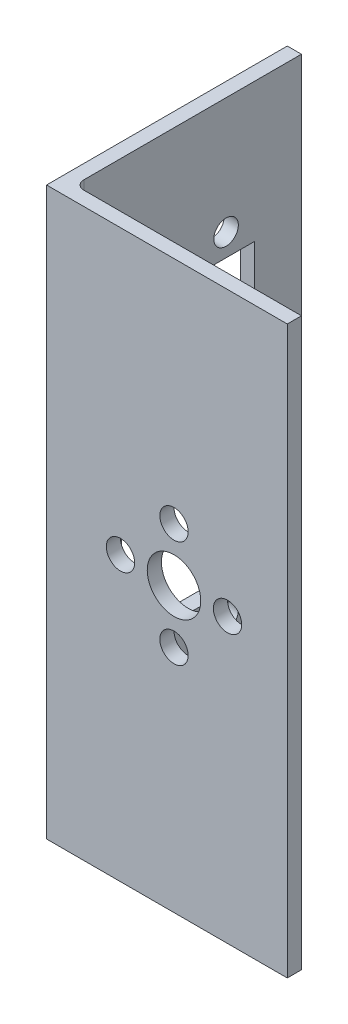
ISO-10303-21;
HEADER;
FILE_DESCRIPTION(('STEP AP214'),'2;1');
FILE_NAME('part.step','',(''),(''),'','','');
FILE_SCHEMA(('AUTOMOTIVE_DESIGN { 1 0 10303 214 1 1 1 1 }'));
ENDSEC;
DATA;
#1=APPLICATION_CONTEXT('core data for automotive mechanical design processes');
#2=APPLICATION_PROTOCOL_DEFINITION('international standard','automotive_design',2000,#1);
#3=PRODUCT_CONTEXT('',#1,'mechanical');
#4=PRODUCT('Part','Part','',(#3));
#5=PRODUCT_RELATED_PRODUCT_CATEGORY('part','',(#4));
#6=PRODUCT_DEFINITION_FORMATION('','',#4);
#7=PRODUCT_DEFINITION_CONTEXT('part definition',#1,'design');
#8=PRODUCT_DEFINITION('design','',#6,#7);
#9=PRODUCT_DEFINITION_SHAPE('','',#8);
#10=(LENGTH_UNIT() NAMED_UNIT(*) SI_UNIT(.MILLI.,.METRE.));
#11=(NAMED_UNIT(*) PLANE_ANGLE_UNIT() SI_UNIT($,.RADIAN.));
#12=(NAMED_UNIT(*) SI_UNIT($,.STERADIAN.) SOLID_ANGLE_UNIT());
#13=UNCERTAINTY_MEASURE_WITH_UNIT(LENGTH_MEASURE(1.E-05),#10,'distance_accuracy_value','');
#14=(GEOMETRIC_REPRESENTATION_CONTEXT(3) GLOBAL_UNCERTAINTY_ASSIGNED_CONTEXT((#13)) GLOBAL_UNIT_ASSIGNED_CONTEXT((#10,
#11,#12)) REPRESENTATION_CONTEXT('',''));
#15=CARTESIAN_POINT('',(0.,0.,0.));
#16=DIRECTION('',(0.,0.,1.));
#17=DIRECTION('',(1.,0.,0.));
#18=AXIS2_PLACEMENT_3D('',#15,#16,#17);
#19=CARTESIAN_POINT('',(-3.17500000000001,127.,-50.8));
#20=DIRECTION('',(0.,0.,1.));
#21=DIRECTION('',(1.,0.,0.));
#22=AXIS2_PLACEMENT_3D('',#19,#20,#21);
#23=PLANE('',#22);
#24=DIRECTION('',(-1.,0.,0.));
#25=VECTOR('',#24,1.);
#26=CARTESIAN_POINT('',(-3.17500000000001,0.,-50.8));
#27=LINE('',#26,#25);
#28=CARTESIAN_POINT('',(0.,0.,-50.8));
#29=VERTEX_POINT('',#28);
#30=CARTESIAN_POINT('',(-3.17500000000001,0.,-50.8));
#31=VERTEX_POINT('',#30);
#32=EDGE_CURVE('E204',#29,#31,#27,.T.);
#33=ORIENTED_EDGE('',*,*,#32,.T.);
#34=DIRECTION('',(0.,-1.,0.));
#35=VECTOR('',#34,1.);
#36=CARTESIAN_POINT('',(-3.17500000000001,127.,-50.8));
#37=LINE('',#36,#35);
#38=CARTESIAN_POINT('',(-3.17500000000001,127.,-50.8));
#39=VERTEX_POINT('',#38);
#40=EDGE_CURVE('E242',#39,#31,#37,.T.);
#41=ORIENTED_EDGE('',*,*,#40,.F.);
#42=DIRECTION('',(-1.,0.,0.));
#43=VECTOR('',#42,1.);
#44=CARTESIAN_POINT('',(-3.17500000000001,127.,-50.8));
#45=LINE('',#44,#43);
#46=CARTESIAN_POINT('',(0.,127.,-50.8));
#47=VERTEX_POINT('',#46);
#48=EDGE_CURVE('E205',#47,#39,#45,.T.);
#49=ORIENTED_EDGE('',*,*,#48,.F.);
#50=DIRECTION('',(0.,-1.,0.));
#51=VECTOR('',#50,1.);
#52=CARTESIAN_POINT('',(0.,127.,-50.8));
#53=LINE('',#52,#51);
#54=EDGE_CURVE('E219',#47,#29,#53,.T.);
#55=ORIENTED_EDGE('',*,*,#54,.T.);
#56=EDGE_LOOP('',(#33,#41,#49,#55));
#57=FACE_BOUND('',#56,.T.);
#58=ADVANCED_FACE('F41',(#57),#23,.F.);
#59=CARTESIAN_POINT('',(-3.17500000000001,127.,-50.8));
#60=DIRECTION('',(1.,0.,0.));
#61=DIRECTION('',(0.,0.,-1.));
#62=AXIS2_PLACEMENT_3D('',#59,#60,#61);
#63=PLANE('',#62);
#64=CARTESIAN_POINT('',(-3.17500000000001,26.0999999999999,-33.9));
#65=DIRECTION('',(1.,0.,0.));
#66=DIRECTION('',(0.,0.,-1.));
#67=AXIS2_PLACEMENT_3D('',#64,#65,#66);
#68=CIRCLE('',#67,2.74999999999999);
#69=CARTESIAN_POINT('',(-3.17500000000001,26.0999999999999,-36.65));
#70=VERTEX_POINT('',#69);
#71=EDGE_CURVE('E155',#70,#70,#68,.F.);
#72=ORIENTED_EDGE('',*,*,#71,.F.);
#73=EDGE_LOOP('',(#72));
#74=FACE_BOUND('',#73,.T.);
#75=CARTESIAN_POINT('',(-3.17500000000001,100.9,-33.9));
#76=DIRECTION('',(1.,0.,0.));
#77=DIRECTION('',(0.,0.,-1.));
#78=AXIS2_PLACEMENT_3D('',#75,#76,#77);
#79=CIRCLE('',#78,2.75);
#80=CARTESIAN_POINT('',(-3.17500000000001,100.9,-36.65));
#81=VERTEX_POINT('',#80);
#82=EDGE_CURVE('E163',#81,#81,#79,.F.);
#83=ORIENTED_EDGE('',*,*,#82,.F.);
#84=EDGE_LOOP('',(#83));
#85=FACE_BOUND('',#84,.T.);
#86=CARTESIAN_POINT('',(-3.17500000000001,100.9,-16.9));
#87=DIRECTION('',(1.,0.,0.));
#88=DIRECTION('',(0.,0.,-1.));
#89=AXIS2_PLACEMENT_3D('',#86,#87,#88);
#90=CIRCLE('',#89,2.74999999999997);
#91=CARTESIAN_POINT('',(-3.17500000000001,100.9,-19.65));
#92=VERTEX_POINT('',#91);
#93=EDGE_CURVE('E151',#92,#92,#90,.F.);
#94=ORIENTED_EDGE('',*,*,#93,.F.);
#95=EDGE_LOOP('',(#94));
#96=FACE_BOUND('',#95,.T.);
#97=DIRECTION('',(0.,0.,-1.));
#98=VECTOR('',#97,1.);
#99=CARTESIAN_POINT('',(-3.17500000000001,95.9,-10.5));
#100=LINE('',#99,#98);
#101=CARTESIAN_POINT('',(-3.17500000000001,95.9,-10.5));
#102=VERTEX_POINT('',#101);
#103=CARTESIAN_POINT('',(-3.17500000000001,95.9,-40.3));
#104=VERTEX_POINT('',#103);
#105=EDGE_CURVE('E128',#102,#104,#100,.T.);
#106=ORIENTED_EDGE('',*,*,#105,.F.);
#107=DIRECTION('',(0.,1.,0.));
#108=VECTOR('',#107,1.);
#109=CARTESIAN_POINT('',(-3.17500000000001,95.9,-10.5));
#110=LINE('',#109,#108);
#111=CARTESIAN_POINT('',(-3.17500000000001,31.1,-10.5));
#112=VERTEX_POINT('',#111);
#113=EDGE_CURVE('E138',#112,#102,#110,.T.);
#114=ORIENTED_EDGE('',*,*,#113,.F.);
#115=DIRECTION('',(0.,0.,1.));
#116=VECTOR('',#115,1.);
#117=CARTESIAN_POINT('',(-3.17500000000001,31.1,-10.5));
#118=LINE('',#117,#116);
#119=CARTESIAN_POINT('',(-3.17500000000001,31.1,-40.3));
#120=VERTEX_POINT('',#119);
#121=EDGE_CURVE('E135',#120,#112,#118,.T.);
#122=ORIENTED_EDGE('',*,*,#121,.F.);
#123=DIRECTION('',(0.,-1.,0.));
#124=VECTOR('',#123,1.);
#125=CARTESIAN_POINT('',(-3.17500000000001,95.9,-40.3));
#126=LINE('',#125,#124);
#127=EDGE_CURVE('E149',#104,#120,#126,.T.);
#128=ORIENTED_EDGE('',*,*,#127,.F.);
#129=EDGE_LOOP('',(#106,#114,#122,#128));
#130=FACE_BOUND('',#129,.T.);
#131=CARTESIAN_POINT('',(-3.17500000000001,26.0999999999999,-16.9));
#132=DIRECTION('',(1.,0.,0.));
#133=DIRECTION('',(0.,0.,-1.));
#134=AXIS2_PLACEMENT_3D('',#131,#132,#133);
#135=CIRCLE('',#134,2.74999999999997);
#136=CARTESIAN_POINT('',(-3.17500000000001,26.0999999999999,-19.65));
#137=VERTEX_POINT('',#136);
#138=EDGE_CURVE('E171',#137,#137,#135,.F.);
#139=ORIENTED_EDGE('',*,*,#138,.F.);
#140=EDGE_LOOP('',(#139));
#141=FACE_BOUND('',#140,.T.);
#142=DIRECTION('',(0.,0.,1.));
#143=VECTOR('',#142,1.);
#144=CARTESIAN_POINT('',(-3.17500000000001,0.,-50.8));
#145=LINE('',#144,#143);
#146=CARTESIAN_POINT('',(-3.17500000000001,0.,3.175));
#147=VERTEX_POINT('',#146);
#148=EDGE_CURVE('E222',#31,#147,#145,.T.);
#149=ORIENTED_EDGE('',*,*,#148,.T.);
#150=DIRECTION('',(0.,-1.,0.));
#151=VECTOR('',#150,1.);
#152=CARTESIAN_POINT('',(-3.17500000000001,127.,3.175));
#153=LINE('',#152,#151);
#154=CARTESIAN_POINT('',(-3.17500000000001,127.,3.175));
#155=VERTEX_POINT('',#154);
#156=EDGE_CURVE('E239',#155,#147,#153,.T.);
#157=ORIENTED_EDGE('',*,*,#156,.F.);
#158=DIRECTION('',(0.,0.,1.));
#159=VECTOR('',#158,1.);
#160=CARTESIAN_POINT('',(-3.17500000000001,127.,-50.8));
#161=LINE('',#160,#159);
#162=EDGE_CURVE('E208',#39,#155,#161,.T.);
#163=ORIENTED_EDGE('',*,*,#162,.F.);
#164=ORIENTED_EDGE('',*,*,#40,.T.);
#165=EDGE_LOOP('',(#149,#157,#163,#164));
#166=FACE_BOUND('',#165,.T.);
#167=ADVANCED_FACE('F147',(#74,#85,#96,#130,#141,#166),#63,.F.);
#168=CARTESIAN_POINT('',(-3.17500000000001,127.,3.175));
#169=DIRECTION('',(0.,0.,-1.));
#170=DIRECTION('',(-1.,0.,0.));
#171=AXIS2_PLACEMENT_3D('',#168,#169,#170);
#172=PLANE('',#171);
#173=CARTESIAN_POINT('',(13.4,63.5000000000002,3.175));
#174=DIRECTION('',(0.,0.,-1.));
#175=DIRECTION('',(-1.,0.,0.));
#176=AXIS2_PLACEMENT_3D('',#173,#174,#175);
#177=CIRCLE('',#176,3.175);
#178=CARTESIAN_POINT('',(10.225,63.5000000000002,3.175));
#179=VERTEX_POINT('',#178);
#180=EDGE_CURVE('E187',#179,#179,#177,.F.);
#181=ORIENTED_EDGE('',*,*,#180,.F.);
#182=EDGE_LOOP('',(#181));
#183=FACE_BOUND('',#182,.T.);
#184=CARTESIAN_POINT('',(25.3999999999997,51.5000000000002,3.175));
#185=DIRECTION('',(0.,0.,-1.));
#186=DIRECTION('',(-1.,0.,0.));
#187=AXIS2_PLACEMENT_3D('',#184,#185,#186);
#188=CIRCLE('',#187,3.175);
#189=CARTESIAN_POINT('',(22.2249999999997,51.5000000000002,3.175));
#190=VERTEX_POINT('',#189);
#191=EDGE_CURVE('E182',#190,#190,#188,.F.);
#192=ORIENTED_EDGE('',*,*,#191,.F.);
#193=EDGE_LOOP('',(#192));
#194=FACE_BOUND('',#193,.T.);
#195=CARTESIAN_POINT('',(37.3999999999998,63.5,3.175));
#196=DIRECTION('',(0.,0.,-1.));
#197=DIRECTION('',(-1.,0.,0.));
#198=AXIS2_PLACEMENT_3D('',#195,#196,#197);
#199=CIRCLE('',#198,3.175);
#200=CARTESIAN_POINT('',(34.2249999999998,63.5,3.175));
#201=VERTEX_POINT('',#200);
#202=EDGE_CURVE('E175',#201,#201,#199,.F.);
#203=ORIENTED_EDGE('',*,*,#202,.F.);
#204=EDGE_LOOP('',(#203));
#205=FACE_BOUND('',#204,.T.);
#206=CARTESIAN_POINT('',(25.4,75.5,3.175));
#207=DIRECTION('',(0.,0.,-1.));
#208=DIRECTION('',(-1.,0.,0.));
#209=AXIS2_PLACEMENT_3D('',#206,#207,#208);
#210=CIRCLE('',#209,3.175);
#211=CARTESIAN_POINT('',(22.225,75.5,3.175));
#212=VERTEX_POINT('',#211);
#213=EDGE_CURVE('E174',#212,#212,#210,.F.);
#214=ORIENTED_EDGE('',*,*,#213,.F.);
#215=EDGE_LOOP('',(#214));
#216=FACE_BOUND('',#215,.T.);
#217=CARTESIAN_POINT('',(25.4,63.5,3.175));
#218=DIRECTION('',(0.,0.,-1.));
#219=DIRECTION('',(-1.,0.,0.));
#220=AXIS2_PLACEMENT_3D('',#217,#218,#219);
#221=CIRCLE('',#220,6.);
#222=CARTESIAN_POINT('',(19.4,63.5,3.175));
#223=VERTEX_POINT('',#222);
#224=EDGE_CURVE('E201',#223,#223,#221,.F.);
#225=ORIENTED_EDGE('',*,*,#224,.F.);
#226=EDGE_LOOP('',(#225));
#227=FACE_BOUND('',#226,.T.);
#228=DIRECTION('',(1.,0.,0.));
#229=VECTOR('',#228,1.);
#230=CARTESIAN_POINT('',(-3.17500000000001,0.,3.175));
#231=LINE('',#230,#229);
#232=CARTESIAN_POINT('',(50.8,0.,3.175));
#233=VERTEX_POINT('',#232);
#234=EDGE_CURVE('E224',#147,#233,#231,.T.);
#235=ORIENTED_EDGE('',*,*,#234,.T.);
#236=DIRECTION('',(0.,-1.,0.));
#237=VECTOR('',#236,1.);
#238=CARTESIAN_POINT('',(50.8,127.,3.175));
#239=LINE('',#238,#237);
#240=CARTESIAN_POINT('',(50.8,127.,3.175));
#241=VERTEX_POINT('',#240);
#242=EDGE_CURVE('E236',#241,#233,#239,.T.);
#243=ORIENTED_EDGE('',*,*,#242,.F.);
#244=DIRECTION('',(1.,0.,0.));
#245=VECTOR('',#244,1.);
#246=CARTESIAN_POINT('',(-3.17500000000001,127.,3.175));
#247=LINE('',#246,#245);
#248=EDGE_CURVE('E211',#155,#241,#247,.T.);
#249=ORIENTED_EDGE('',*,*,#248,.F.);
#250=ORIENTED_EDGE('',*,*,#156,.T.);
#251=EDGE_LOOP('',(#235,#243,#249,#250));
#252=FACE_BOUND('',#251,.T.);
#253=ADVANCED_FACE('F276',(#183,#194,#205,#216,#227,#252),#172,.F.);
#254=CARTESIAN_POINT('',(50.8,127.,0.));
#255=DIRECTION('',(-1.,0.,0.));
#256=DIRECTION('',(0.,0.,1.));
#257=AXIS2_PLACEMENT_3D('',#254,#255,#256);
#258=PLANE('',#257);
#259=DIRECTION('',(0.,0.,-1.));
#260=VECTOR('',#259,1.);
#261=CARTESIAN_POINT('',(50.8,0.,0.));
#262=LINE('',#261,#260);
#263=CARTESIAN_POINT('',(50.8,0.,0.));
#264=VERTEX_POINT('',#263);
#265=EDGE_CURVE('E226',#233,#264,#262,.T.);
#266=ORIENTED_EDGE('',*,*,#265,.T.);
#267=DIRECTION('',(0.,-1.,0.));
#268=VECTOR('',#267,1.);
#269=CARTESIAN_POINT('',(50.8,127.,0.));
#270=LINE('',#269,#268);
#271=CARTESIAN_POINT('',(50.8,127.,0.));
#272=VERTEX_POINT('',#271);
#273=EDGE_CURVE('E233',#272,#264,#270,.T.);
#274=ORIENTED_EDGE('',*,*,#273,.F.);
#275=DIRECTION('',(0.,0.,-1.));
#276=VECTOR('',#275,1.);
#277=CARTESIAN_POINT('',(50.8,127.,0.));
#278=LINE('',#277,#276);
#279=EDGE_CURVE('E213',#241,#272,#278,.T.);
#280=ORIENTED_EDGE('',*,*,#279,.F.);
#281=ORIENTED_EDGE('',*,*,#242,.T.);
#282=EDGE_LOOP('',(#266,#274,#280,#281));
#283=FACE_BOUND('',#282,.T.);
#284=ADVANCED_FACE('F282',(#283),#258,.F.);
#285=CARTESIAN_POINT('',(0.,127.,0.));
#286=DIRECTION('',(0.,0.,1.));
#287=DIRECTION('',(1.,0.,0.));
#288=AXIS2_PLACEMENT_3D('',#285,#286,#287);
#289=PLANE('',#288);
#290=CARTESIAN_POINT('',(13.4,63.5000000000002,0.));
#291=DIRECTION('',(0.,0.,-1.));
#292=DIRECTION('',(-1.,0.,0.));
#293=AXIS2_PLACEMENT_3D('',#290,#291,#292);
#294=CIRCLE('',#293,3.175);
#295=CARTESIAN_POINT('',(10.225,63.5000000000002,0.));
#296=VERTEX_POINT('',#295);
#297=EDGE_CURVE('E190',#296,#296,#294,.T.);
#298=ORIENTED_EDGE('',*,*,#297,.F.);
#299=EDGE_LOOP('',(#298));
#300=FACE_BOUND('',#299,.T.);
#301=CARTESIAN_POINT('',(25.3999999999997,51.5000000000002,0.));
#302=DIRECTION('',(0.,0.,-1.));
#303=DIRECTION('',(-1.,0.,0.));
#304=AXIS2_PLACEMENT_3D('',#301,#302,#303);
#305=CIRCLE('',#304,3.175);
#306=CARTESIAN_POINT('',(22.2249999999997,51.5000000000002,0.));
#307=VERTEX_POINT('',#306);
#308=EDGE_CURVE('E191',#307,#307,#305,.T.);
#309=ORIENTED_EDGE('',*,*,#308,.F.);
#310=EDGE_LOOP('',(#309));
#311=FACE_BOUND('',#310,.T.);
#312=CARTESIAN_POINT('',(37.3999999999998,63.5,0.));
#313=DIRECTION('',(0.,0.,-1.));
#314=DIRECTION('',(-1.,0.,0.));
#315=AXIS2_PLACEMENT_3D('',#312,#313,#314);
#316=CIRCLE('',#315,3.175);
#317=CARTESIAN_POINT('',(34.2249999999998,63.5,0.));
#318=VERTEX_POINT('',#317);
#319=EDGE_CURVE('E178',#318,#318,#316,.T.);
#320=ORIENTED_EDGE('',*,*,#319,.F.);
#321=EDGE_LOOP('',(#320));
#322=FACE_BOUND('',#321,.T.);
#323=CARTESIAN_POINT('',(25.4,75.5,0.));
#324=DIRECTION('',(0.,0.,-1.));
#325=DIRECTION('',(-1.,0.,0.));
#326=AXIS2_PLACEMENT_3D('',#323,#324,#325);
#327=CIRCLE('',#326,3.175);
#328=CARTESIAN_POINT('',(22.225,75.5,0.));
#329=VERTEX_POINT('',#328);
#330=EDGE_CURVE('E179',#329,#329,#327,.T.);
#331=ORIENTED_EDGE('',*,*,#330,.F.);
#332=EDGE_LOOP('',(#331));
#333=FACE_BOUND('',#332,.T.);
#334=CARTESIAN_POINT('',(25.4,63.5,0.));
#335=DIRECTION('',(0.,0.,-1.));
#336=DIRECTION('',(-1.,0.,0.));
#337=AXIS2_PLACEMENT_3D('',#334,#335,#336);
#338=CIRCLE('',#337,6.);
#339=CARTESIAN_POINT('',(19.4,63.5,0.));
#340=VERTEX_POINT('',#339);
#341=EDGE_CURVE('E194',#340,#340,#338,.T.);
#342=ORIENTED_EDGE('',*,*,#341,.F.);
#343=EDGE_LOOP('',(#342));
#344=FACE_BOUND('',#343,.T.);
#345=DIRECTION('',(-1.,0.,0.));
#346=VECTOR('',#345,1.);
#347=CARTESIAN_POINT('',(0.,0.,0.));
#348=LINE('',#347,#346);
#349=CARTESIAN_POINT('',(2.,0.,0.));
#350=VERTEX_POINT('',#349);
#351=EDGE_CURVE('E228',#264,#350,#348,.T.);
#352=ORIENTED_EDGE('',*,*,#351,.T.);
#353=DIRECTION('',(0.,-1.,0.));
#354=VECTOR('',#353,1.);
#355=CARTESIAN_POINT('',(2.,127.,0.));
#356=LINE('',#355,#354);
#357=CARTESIAN_POINT('',(2.,127.,0.));
#358=VERTEX_POINT('',#357);
#359=EDGE_CURVE('E56',#350,#358,#356,.F.);
#360=ORIENTED_EDGE('',*,*,#359,.T.);
#361=DIRECTION('',(-1.,0.,0.));
#362=VECTOR('',#361,1.);
#363=CARTESIAN_POINT('',(0.,127.,0.));
#364=LINE('',#363,#362);
#365=EDGE_CURVE('E215',#272,#358,#364,.T.);
#366=ORIENTED_EDGE('',*,*,#365,.F.);
#367=ORIENTED_EDGE('',*,*,#273,.T.);
#368=EDGE_LOOP('',(#352,#360,#366,#367));
#369=FACE_BOUND('',#368,.T.);
#370=ADVANCED_FACE('F286',(#300,#311,#322,#333,#344,#369),#289,.F.);
#371=CARTESIAN_POINT('',(0.,127.,-50.8));
#372=DIRECTION('',(-1.,0.,0.));
#373=DIRECTION('',(0.,0.,1.));
#374=AXIS2_PLACEMENT_3D('',#371,#372,#373);
#375=PLANE('',#374);
#376=CARTESIAN_POINT('',(0.,26.0999999999999,-33.9));
#377=DIRECTION('',(1.,0.,0.));
#378=DIRECTION('',(0.,0.,-1.));
#379=AXIS2_PLACEMENT_3D('',#376,#377,#378);
#380=CIRCLE('',#379,2.74999999999999);
#381=CARTESIAN_POINT('',(0.,26.0999999999999,-36.65));
#382=VERTEX_POINT('',#381);
#383=EDGE_CURVE('E158',#382,#382,#380,.T.);
#384=ORIENTED_EDGE('',*,*,#383,.F.);
#385=EDGE_LOOP('',(#384));
#386=FACE_BOUND('',#385,.T.);
#387=CARTESIAN_POINT('',(0.,100.9,-33.9));
#388=DIRECTION('',(1.,0.,0.));
#389=DIRECTION('',(0.,0.,1.));
#390=AXIS2_PLACEMENT_3D('',#387,#388,#389);
#391=CIRCLE('',#390,2.75);
#392=CARTESIAN_POINT('',(0.,100.9,-31.15));
#393=VERTEX_POINT('',#392);
#394=EDGE_CURVE('E159',#393,#393,#391,.T.);
#395=ORIENTED_EDGE('',*,*,#394,.F.);
#396=EDGE_LOOP('',(#395));
#397=FACE_BOUND('',#396,.T.);
#398=CARTESIAN_POINT('',(0.,100.9,-16.9));
#399=DIRECTION('',(1.,0.,0.));
#400=DIRECTION('',(0.,0.,1.));
#401=AXIS2_PLACEMENT_3D('',#398,#399,#400);
#402=CIRCLE('',#401,2.74999999999997);
#403=CARTESIAN_POINT('',(0.,100.9,-14.15));
#404=VERTEX_POINT('',#403);
#405=EDGE_CURVE('E166',#404,#404,#402,.T.);
#406=ORIENTED_EDGE('',*,*,#405,.F.);
#407=EDGE_LOOP('',(#406));
#408=FACE_BOUND('',#407,.T.);
#409=DIRECTION('',(0.,0.,-1.));
#410=VECTOR('',#409,1.);
#411=CARTESIAN_POINT('',(0.,31.1,-10.5));
#412=LINE('',#411,#410);
#413=CARTESIAN_POINT('',(0.,31.1,-10.5));
#414=VERTEX_POINT('',#413);
#415=CARTESIAN_POINT('',(0.,31.1,-40.3));
#416=VERTEX_POINT('',#415);
#417=EDGE_CURVE('E360',#414,#416,#412,.T.);
#418=ORIENTED_EDGE('',*,*,#417,.F.);
#419=DIRECTION('',(0.,-1.,0.));
#420=VECTOR('',#419,1.);
#421=CARTESIAN_POINT('',(0.,95.9,-10.5));
#422=LINE('',#421,#420);
#423=CARTESIAN_POINT('',(0.,95.9,-10.5));
#424=VERTEX_POINT('',#423);
#425=EDGE_CURVE('E145',#424,#414,#422,.T.);
#426=ORIENTED_EDGE('',*,*,#425,.F.);
#427=DIRECTION('',(0.,0.,1.));
#428=VECTOR('',#427,1.);
#429=CARTESIAN_POINT('',(0.,95.9,-10.5));
#430=LINE('',#429,#428);
#431=CARTESIAN_POINT('',(0.,95.9,-40.3));
#432=VERTEX_POINT('',#431);
#433=EDGE_CURVE('E131',#432,#424,#430,.T.);
#434=ORIENTED_EDGE('',*,*,#433,.F.);
#435=DIRECTION('',(0.,1.,0.));
#436=VECTOR('',#435,1.);
#437=CARTESIAN_POINT('',(0.,95.9,-40.3));
#438=LINE('',#437,#436);
#439=EDGE_CURVE('E357',#416,#432,#438,.T.);
#440=ORIENTED_EDGE('',*,*,#439,.F.);
#441=EDGE_LOOP('',(#418,#426,#434,#440));
#442=FACE_BOUND('',#441,.T.);
#443=CARTESIAN_POINT('',(0.,26.0999999999999,-16.9));
#444=DIRECTION('',(1.,0.,0.));
#445=DIRECTION('',(0.,0.,-1.));
#446=AXIS2_PLACEMENT_3D('',#443,#444,#445);
#447=CIRCLE('',#446,2.74999999999997);
#448=CARTESIAN_POINT('',(0.,26.0999999999999,-19.65));
#449=VERTEX_POINT('',#448);
#450=EDGE_CURVE('E162',#449,#449,#447,.T.);
#451=ORIENTED_EDGE('',*,*,#450,.F.);
#452=EDGE_LOOP('',(#451));
#453=FACE_BOUND('',#452,.T.);
#454=DIRECTION('',(0.,0.,-1.));
#455=VECTOR('',#454,1.);
#456=CARTESIAN_POINT('',(0.,127.,-50.8));
#457=LINE('',#456,#455);
#458=CARTESIAN_POINT('',(0.,127.,-2.));
#459=VERTEX_POINT('',#458);
#460=EDGE_CURVE('E217',#459,#47,#457,.T.);
#461=ORIENTED_EDGE('',*,*,#460,.F.);
#462=DIRECTION('',(0.,-1.,0.));
#463=VECTOR('',#462,1.);
#464=CARTESIAN_POINT('',(0.,0.,-2.));
#465=LINE('',#464,#463);
#466=CARTESIAN_POINT('',(0.,0.,-2.));
#467=VERTEX_POINT('',#466);
#468=EDGE_CURVE('E245',#459,#467,#465,.T.);
#469=ORIENTED_EDGE('',*,*,#468,.T.);
#470=DIRECTION('',(0.,0.,-1.));
#471=VECTOR('',#470,1.);
#472=CARTESIAN_POINT('',(0.,0.,-50.8));
#473=LINE('',#472,#471);
#474=EDGE_CURVE('E209',#467,#29,#473,.T.);
#475=ORIENTED_EDGE('',*,*,#474,.T.);
#476=ORIENTED_EDGE('',*,*,#54,.F.);
#477=EDGE_LOOP('',(#461,#469,#475,#476));
#478=FACE_BOUND('',#477,.T.);
#479=ADVANCED_FACE('F251',(#386,#397,#408,#442,#453,#478),#375,.F.);
#480=CARTESIAN_POINT('',(0.,127.,0.));
#481=DIRECTION('',(0.,-1.,0.));
#482=DIRECTION('',(0.,0.,-1.));
#483=AXIS2_PLACEMENT_3D('',#480,#481,#482);
#484=PLANE('',#483);
#485=ORIENTED_EDGE('',*,*,#48,.T.);
#486=ORIENTED_EDGE('',*,*,#162,.T.);
#487=ORIENTED_EDGE('',*,*,#248,.T.);
#488=ORIENTED_EDGE('',*,*,#279,.T.);
#489=ORIENTED_EDGE('',*,*,#365,.T.);
#490=CARTESIAN_POINT('',(2.,127.,-2.));
#491=DIRECTION('',(0.,-1.,0.));
#492=DIRECTION('',(0.,0.,-1.));
#493=AXIS2_PLACEMENT_3D('',#490,#491,#492);
#494=CIRCLE('',#493,2.);
#495=EDGE_CURVE('E11',#358,#459,#494,.T.);
#496=ORIENTED_EDGE('',*,*,#495,.T.);
#497=ORIENTED_EDGE('',*,*,#460,.T.);
#498=EDGE_LOOP('',(#485,#486,#487,#488,#489,#496,#497));
#499=FACE_BOUND('',#498,.T.);
#500=ADVANCED_FACE('F262',(#499),#484,.F.);
#501=CARTESIAN_POINT('',(0.,0.,0.));
#502=DIRECTION('',(0.,-1.,0.));
#503=DIRECTION('',(0.,0.,-1.));
#504=AXIS2_PLACEMENT_3D('',#501,#502,#503);
#505=PLANE('',#504);
#506=ORIENTED_EDGE('',*,*,#32,.F.);
#507=ORIENTED_EDGE('',*,*,#474,.F.);
#508=CARTESIAN_POINT('',(2.,0.,-2.));
#509=DIRECTION('',(0.,-1.,0.));
#510=DIRECTION('',(0.,0.,-1.));
#511=AXIS2_PLACEMENT_3D('',#508,#509,#510);
#512=CIRCLE('',#511,2.);
#513=EDGE_CURVE('E49',#467,#350,#512,.F.);
#514=ORIENTED_EDGE('',*,*,#513,.T.);
#515=ORIENTED_EDGE('',*,*,#351,.F.);
#516=ORIENTED_EDGE('',*,*,#265,.F.);
#517=ORIENTED_EDGE('',*,*,#234,.F.);
#518=ORIENTED_EDGE('',*,*,#148,.F.);
#519=EDGE_LOOP('',(#506,#507,#514,#515,#516,#517,#518));
#520=FACE_BOUND('',#519,.T.);
#521=ADVANCED_FACE('F256',(#520),#505,.T.);
#522=CARTESIAN_POINT('',(25.4,63.5,3.176));
#523=DIRECTION('',(0.,0.,-1.));
#524=DIRECTION('',(-1.,0.,0.));
#525=AXIS2_PLACEMENT_3D('',#522,#523,#524);
#526=CYLINDRICAL_SURFACE('',#525,6.);
#527=ORIENTED_EDGE('',*,*,#341,.T.);
#528=EDGE_LOOP('',(#527));
#529=FACE_BOUND('',#528,.T.);
#530=ORIENTED_EDGE('',*,*,#224,.T.);
#531=EDGE_LOOP('',(#530));
#532=FACE_BOUND('',#531,.T.);
#533=ADVANCED_FACE('F296',(#529,#532),#526,.F.);
#534=CARTESIAN_POINT('',(25.4,75.5,3.176));
#535=DIRECTION('',(0.,0.,-1.));
#536=DIRECTION('',(-1.,0.,0.));
#537=AXIS2_PLACEMENT_3D('',#534,#535,#536);
#538=CYLINDRICAL_SURFACE('',#537,3.175);
#539=ORIENTED_EDGE('',*,*,#330,.T.);
#540=EDGE_LOOP('',(#539));
#541=FACE_BOUND('',#540,.T.);
#542=ORIENTED_EDGE('',*,*,#213,.T.);
#543=EDGE_LOOP('',(#542));
#544=FACE_BOUND('',#543,.T.);
#545=ADVANCED_FACE('F301',(#541,#544),#538,.F.);
#546=CARTESIAN_POINT('',(37.3999999999998,63.5,3.176));
#547=DIRECTION('',(0.,0.,-1.));
#548=DIRECTION('',(-1.,0.,0.));
#549=AXIS2_PLACEMENT_3D('',#546,#547,#548);
#550=CYLINDRICAL_SURFACE('',#549,3.175);
#551=ORIENTED_EDGE('',*,*,#319,.T.);
#552=EDGE_LOOP('',(#551));
#553=FACE_BOUND('',#552,.T.);
#554=ORIENTED_EDGE('',*,*,#202,.T.);
#555=EDGE_LOOP('',(#554));
#556=FACE_BOUND('',#555,.T.);
#557=ADVANCED_FACE('F307',(#553,#556),#550,.F.);
#558=CARTESIAN_POINT('',(25.3999999999997,51.5000000000002,3.176));
#559=DIRECTION('',(0.,0.,-1.));
#560=DIRECTION('',(-1.,0.,0.));
#561=AXIS2_PLACEMENT_3D('',#558,#559,#560);
#562=CYLINDRICAL_SURFACE('',#561,3.175);
#563=ORIENTED_EDGE('',*,*,#308,.T.);
#564=EDGE_LOOP('',(#563));
#565=FACE_BOUND('',#564,.T.);
#566=ORIENTED_EDGE('',*,*,#191,.T.);
#567=EDGE_LOOP('',(#566));
#568=FACE_BOUND('',#567,.T.);
#569=ADVANCED_FACE('F303',(#565,#568),#562,.F.);
#570=CARTESIAN_POINT('',(13.4,63.5000000000002,3.176));
#571=DIRECTION('',(0.,0.,-1.));
#572=DIRECTION('',(-1.,0.,0.));
#573=AXIS2_PLACEMENT_3D('',#570,#571,#572);
#574=CYLINDRICAL_SURFACE('',#573,3.175);
#575=ORIENTED_EDGE('',*,*,#297,.T.);
#576=EDGE_LOOP('',(#575));
#577=FACE_BOUND('',#576,.T.);
#578=ORIENTED_EDGE('',*,*,#180,.T.);
#579=EDGE_LOOP('',(#578));
#580=FACE_BOUND('',#579,.T.);
#581=ADVANCED_FACE('F306',(#577,#580),#574,.F.);
#582=CARTESIAN_POINT('',(-3.17600000000001,26.0999999999999,-16.9));
#583=DIRECTION('',(1.,0.,0.));
#584=DIRECTION('',(0.,0.,-1.));
#585=AXIS2_PLACEMENT_3D('',#582,#583,#584);
#586=CYLINDRICAL_SURFACE('',#585,2.74999999999997);
#587=ORIENTED_EDGE('',*,*,#450,.T.);
#588=EDGE_LOOP('',(#587));
#589=FACE_BOUND('',#588,.T.);
#590=ORIENTED_EDGE('',*,*,#138,.T.);
#591=EDGE_LOOP('',(#590));
#592=FACE_BOUND('',#591,.T.);
#593=ADVANCED_FACE('F311',(#589,#592),#586,.F.);
#594=CARTESIAN_POINT('',(-3.17600000000001,95.9,-10.5));
#595=DIRECTION('',(0.,0.,1.));
#596=DIRECTION('',(1.,0.,0.));
#597=AXIS2_PLACEMENT_3D('',#594,#595,#596);
#598=PLANE('',#597);
#599=ORIENTED_EDGE('',*,*,#113,.T.);
#600=DIRECTION('',(1.,0.,0.));
#601=VECTOR('',#600,1.);
#602=CARTESIAN_POINT('',(-3.17600000000001,95.9,-10.5));
#603=LINE('',#602,#601);
#604=EDGE_CURVE('E124',#102,#424,#603,.T.);
#605=ORIENTED_EDGE('',*,*,#604,.T.);
#606=ORIENTED_EDGE('',*,*,#425,.T.);
#607=DIRECTION('',(1.,0.,0.));
#608=VECTOR('',#607,1.);
#609=CARTESIAN_POINT('',(-3.17600000000001,31.1,-10.5));
#610=LINE('',#609,#608);
#611=EDGE_CURVE('E141',#112,#414,#610,.T.);
#612=ORIENTED_EDGE('',*,*,#611,.F.);
#613=EDGE_LOOP('',(#599,#605,#606,#612));
#614=FACE_BOUND('',#613,.T.);
#615=ADVANCED_FACE('F139',(#614),#598,.F.);
#616=CARTESIAN_POINT('',(-3.17600000000001,95.9,-10.5));
#617=DIRECTION('',(0.,1.,0.));
#618=DIRECTION('',(0.,0.,1.));
#619=AXIS2_PLACEMENT_3D('',#616,#617,#618);
#620=PLANE('',#619);
#621=ORIENTED_EDGE('',*,*,#105,.T.);
#622=DIRECTION('',(1.,0.,0.));
#623=VECTOR('',#622,1.);
#624=CARTESIAN_POINT('',(-3.17600000000001,95.9,-40.3));
#625=LINE('',#624,#623);
#626=EDGE_CURVE('E134',#104,#432,#625,.T.);
#627=ORIENTED_EDGE('',*,*,#626,.T.);
#628=ORIENTED_EDGE('',*,*,#433,.T.);
#629=ORIENTED_EDGE('',*,*,#604,.F.);
#630=EDGE_LOOP('',(#621,#627,#628,#629));
#631=FACE_BOUND('',#630,.T.);
#632=ADVANCED_FACE('F126',(#631),#620,.F.);
#633=CARTESIAN_POINT('',(-3.17600000000001,95.9,-40.3));
#634=DIRECTION('',(0.,0.,-1.));
#635=DIRECTION('',(-1.,0.,0.));
#636=AXIS2_PLACEMENT_3D('',#633,#634,#635);
#637=PLANE('',#636);
#638=ORIENTED_EDGE('',*,*,#127,.T.);
#639=DIRECTION('',(1.,0.,0.));
#640=VECTOR('',#639,1.);
#641=CARTESIAN_POINT('',(-3.17600000000001,31.1,-40.3));
#642=LINE('',#641,#640);
#643=EDGE_CURVE('E353',#120,#416,#642,.T.);
#644=ORIENTED_EDGE('',*,*,#643,.T.);
#645=ORIENTED_EDGE('',*,*,#439,.T.);
#646=ORIENTED_EDGE('',*,*,#626,.F.);
#647=EDGE_LOOP('',(#638,#644,#645,#646));
#648=FACE_BOUND('',#647,.T.);
#649=ADVANCED_FACE('F328',(#648),#637,.F.);
#650=CARTESIAN_POINT('',(-3.17600000000001,31.1,-10.5));
#651=DIRECTION('',(0.,-1.,0.));
#652=DIRECTION('',(0.,0.,-1.));
#653=AXIS2_PLACEMENT_3D('',#650,#651,#652);
#654=PLANE('',#653);
#655=ORIENTED_EDGE('',*,*,#121,.T.);
#656=ORIENTED_EDGE('',*,*,#611,.T.);
#657=ORIENTED_EDGE('',*,*,#417,.T.);
#658=ORIENTED_EDGE('',*,*,#643,.F.);
#659=EDGE_LOOP('',(#655,#656,#657,#658));
#660=FACE_BOUND('',#659,.T.);
#661=ADVANCED_FACE('F331',(#660),#654,.F.);
#662=CARTESIAN_POINT('',(-3.17600000000001,100.9,-16.9));
#663=DIRECTION('',(1.,0.,0.));
#664=DIRECTION('',(0.,0.,-1.));
#665=AXIS2_PLACEMENT_3D('',#662,#663,#664);
#666=CYLINDRICAL_SURFACE('',#665,2.74999999999997);
#667=ORIENTED_EDGE('',*,*,#405,.T.);
#668=EDGE_LOOP('',(#667));
#669=FACE_BOUND('',#668,.T.);
#670=ORIENTED_EDGE('',*,*,#93,.T.);
#671=EDGE_LOOP('',(#670));
#672=FACE_BOUND('',#671,.T.);
#673=ADVANCED_FACE('F323',(#669,#672),#666,.F.);
#674=CARTESIAN_POINT('',(-3.17600000000001,100.9,-33.9));
#675=DIRECTION('',(1.,0.,0.));
#676=DIRECTION('',(0.,0.,-1.));
#677=AXIS2_PLACEMENT_3D('',#674,#675,#676);
#678=CYLINDRICAL_SURFACE('',#677,2.75);
#679=ORIENTED_EDGE('',*,*,#394,.T.);
#680=EDGE_LOOP('',(#679));
#681=FACE_BOUND('',#680,.T.);
#682=ORIENTED_EDGE('',*,*,#82,.T.);
#683=EDGE_LOOP('',(#682));
#684=FACE_BOUND('',#683,.T.);
#685=ADVANCED_FACE('F269',(#681,#684),#678,.F.);
#686=CARTESIAN_POINT('',(-3.17600000000001,26.0999999999999,-33.9));
#687=DIRECTION('',(1.,0.,0.));
#688=DIRECTION('',(0.,0.,-1.));
#689=AXIS2_PLACEMENT_3D('',#686,#687,#688);
#690=CYLINDRICAL_SURFACE('',#689,2.74999999999999);
#691=ORIENTED_EDGE('',*,*,#383,.T.);
#692=EDGE_LOOP('',(#691));
#693=FACE_BOUND('',#692,.T.);
#694=ORIENTED_EDGE('',*,*,#71,.T.);
#695=EDGE_LOOP('',(#694));
#696=FACE_BOUND('',#695,.T.);
#697=ADVANCED_FACE('F265',(#693,#696),#690,.F.);
#698=CARTESIAN_POINT('',(2.,127.,-2.));
#699=DIRECTION('',(0.,1.,0.));
#700=DIRECTION('',(0.,0.,1.));
#701=AXIS2_PLACEMENT_3D('',#698,#699,#700);
#702=CYLINDRICAL_SURFACE('',#701,2.);
#703=ORIENTED_EDGE('',*,*,#495,.F.);
#704=ORIENTED_EDGE('',*,*,#359,.F.);
#705=ORIENTED_EDGE('',*,*,#513,.F.);
#706=ORIENTED_EDGE('',*,*,#468,.F.);
#707=EDGE_LOOP('',(#703,#704,#705,#706));
#708=FACE_BOUND('',#707,.T.);
#709=ADVANCED_FACE('F43',(#708),#702,.F.);
#710=CLOSED_SHELL('',(#58,#167,#253,#284,#370,#479,#500,#521,#533,#545,#557,#569,#581,#593,#615,
#632,#649,#661,#673,#685,#697,#709));
#711=MANIFOLD_SOLID_BREP('B2',#710);
#712=ADVANCED_BREP_SHAPE_REPRESENTATION('',(#18,#711),#14);
#713=SHAPE_DEFINITION_REPRESENTATION(#9,#712);
ENDSEC;
END-ISO-10303-21;
